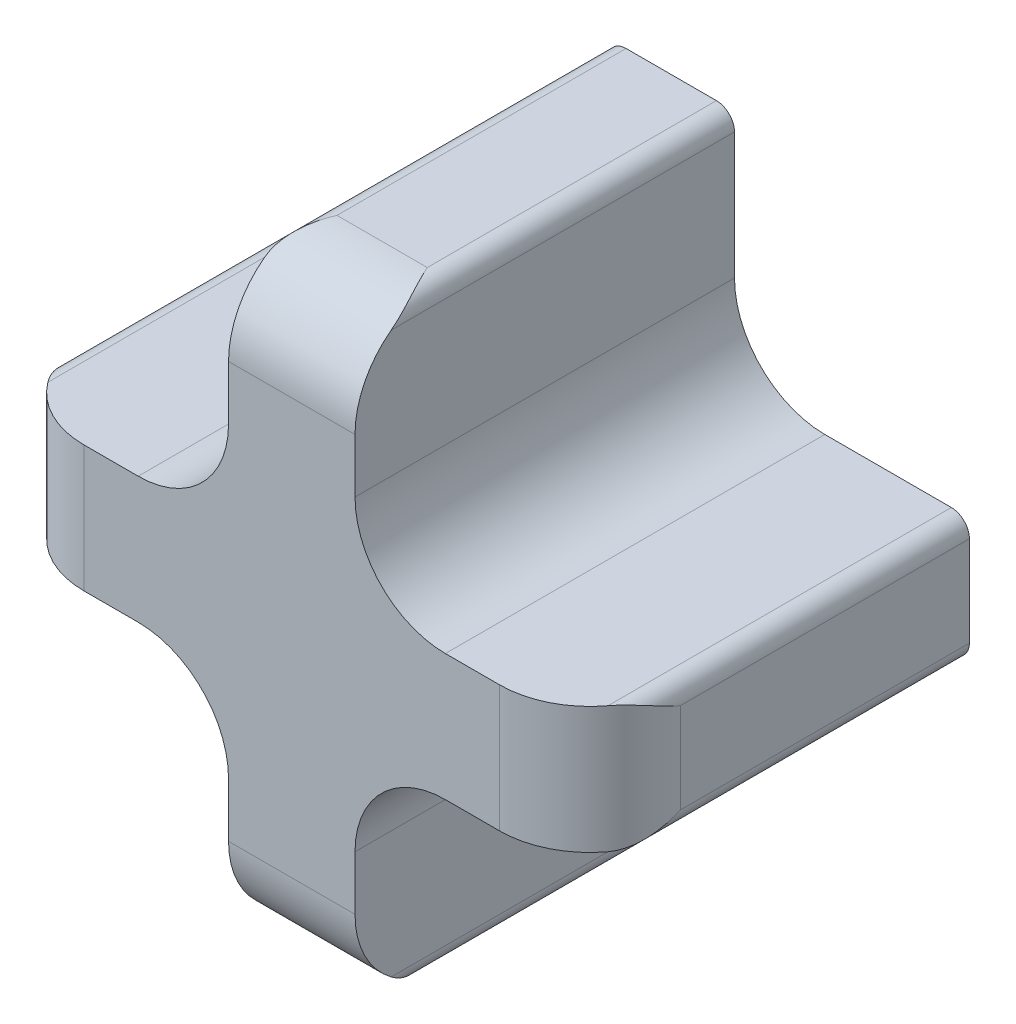
ISO-10303-21;
HEADER;
FILE_DESCRIPTION(('STEP AP214'),'2;1');
FILE_NAME('part.step','',(''),(''),'','','');
FILE_SCHEMA(('AUTOMOTIVE_DESIGN { 1 0 10303 214 1 1 1 1 }'));
ENDSEC;
DATA;
#1=APPLICATION_CONTEXT('core data for automotive mechanical design processes');
#2=APPLICATION_PROTOCOL_DEFINITION('international standard','automotive_design',2000,#1);
#3=PRODUCT_CONTEXT('',#1,'mechanical');
#4=PRODUCT('Part','Part','',(#3));
#5=PRODUCT_RELATED_PRODUCT_CATEGORY('part','',(#4));
#6=PRODUCT_DEFINITION_FORMATION('','',#4);
#7=PRODUCT_DEFINITION_CONTEXT('part definition',#1,'design');
#8=PRODUCT_DEFINITION('design','',#6,#7);
#9=PRODUCT_DEFINITION_SHAPE('','',#8);
#10=(LENGTH_UNIT() NAMED_UNIT(*) SI_UNIT(.MILLI.,.METRE.));
#11=(NAMED_UNIT(*) PLANE_ANGLE_UNIT() SI_UNIT($,.RADIAN.));
#12=(NAMED_UNIT(*) SI_UNIT($,.STERADIAN.) SOLID_ANGLE_UNIT());
#13=UNCERTAINTY_MEASURE_WITH_UNIT(LENGTH_MEASURE(1.E-05),#10,'distance_accuracy_value','');
#14=(GEOMETRIC_REPRESENTATION_CONTEXT(3) GLOBAL_UNCERTAINTY_ASSIGNED_CONTEXT((#13)) GLOBAL_UNIT_ASSIGNED_CONTEXT((#10,
#11,#12)) REPRESENTATION_CONTEXT('',''));
#15=CARTESIAN_POINT('',(0.,0.,0.));
#16=DIRECTION('',(0.,0.,1.));
#17=DIRECTION('',(1.,0.,0.));
#18=AXIS2_PLACEMENT_3D('',#15,#16,#17);
#19=CARTESIAN_POINT('',(-28.6701759385662,-21.7811119836904,2.1));
#20=DIRECTION('',(-1.,0.,0.));
#21=DIRECTION('',(0.,0.,1.));
#22=AXIS2_PLACEMENT_3D('',#19,#20,#21);
#23=PLANE('',#22);
#24=DIRECTION('',(0.,0.,-1.));
#25=VECTOR('',#24,1.);
#26=CARTESIAN_POINT('',(-28.6701759385662,-21.6811119836904,2.1));
#27=LINE('',#26,#25);
#28=CARTESIAN_POINT('',(-28.6701759385662,-21.6811119836904,0.));
#29=VERTEX_POINT('',#28);
#30=CARTESIAN_POINT('',(-28.6701759385662,-21.6811119836904,1.9));
#31=VERTEX_POINT('',#30);
#32=EDGE_CURVE('E280',#29,#31,#27,.F.);
#33=ORIENTED_EDGE('',*,*,#32,.T.);
#34=CARTESIAN_POINT('',(-28.6701759385662,-21.2811119836904,1.6));
#35=DIRECTION('',(-1.,0.,0.));
#36=DIRECTION('',(0.,0.,1.));
#37=AXIS2_PLACEMENT_3D('',#34,#35,#36);
#38=CIRCLE('',#37,0.5);
#39=CARTESIAN_POINT('',(-28.6701759385662,-21.2811119836904,2.1));
#40=VERTEX_POINT('',#39);
#41=EDGE_CURVE('E525',#31,#40,#38,.T.);
#42=ORIENTED_EDGE('',*,*,#41,.T.);
#43=DIRECTION('',(0.,1.,0.));
#44=VECTOR('',#43,1.);
#45=CARTESIAN_POINT('',(-28.6701759385662,-21.7811119836904,2.1));
#46=LINE('',#45,#44);
#47=CARTESIAN_POINT('',(-28.6701759385662,-20.9811119836904,2.1));
#48=VERTEX_POINT('',#47);
#49=EDGE_CURVE('E467',#40,#48,#46,.T.);
#50=ORIENTED_EDGE('',*,*,#49,.T.);
#51=DIRECTION('',(0.,0.,1.));
#52=VECTOR('',#51,1.);
#53=CARTESIAN_POINT('',(-28.6701759385662,-20.9811119836904,0.));
#54=LINE('',#53,#52);
#55=CARTESIAN_POINT('',(-28.6701759385662,-20.9811119836904,0.));
#56=VERTEX_POINT('',#55);
#57=EDGE_CURVE('E298',#48,#56,#54,.F.);
#58=ORIENTED_EDGE('',*,*,#57,.T.);
#59=DIRECTION('',(0.,1.,0.));
#60=VECTOR('',#59,1.);
#61=CARTESIAN_POINT('',(-28.6701759385662,-21.7811119836904,0.));
#62=LINE('',#61,#60);
#63=EDGE_CURVE('E487',#29,#56,#62,.T.);
#64=ORIENTED_EDGE('',*,*,#63,.F.);
#65=EDGE_LOOP('',(#33,#42,#50,#58,#64));
#66=FACE_BOUND('',#65,.T.);
#67=ADVANCED_FACE('F17',(#66),#23,.T.);
#68=CARTESIAN_POINT('',(-27.9701759385662,-21.7811119836904,2.1));
#69=DIRECTION('',(0.,-1.,0.));
#70=DIRECTION('',(1.,0.,0.));
#71=AXIS2_PLACEMENT_3D('',#68,#69,#70);
#72=PLANE('',#71);
#73=DIRECTION('',(0.,0.,-1.));
#74=VECTOR('',#73,1.);
#75=CARTESIAN_POINT('',(-28.0701759385662,-21.7811119836904,2.1));
#76=LINE('',#75,#74);
#77=CARTESIAN_POINT('',(-28.0701759385662,-21.7811119836904,0.));
#78=VERTEX_POINT('',#77);
#79=CARTESIAN_POINT('',(-28.0701759385662,-21.7811119836904,1.6));
#80=VERTEX_POINT('',#79);
#81=EDGE_CURVE('E275',#78,#80,#76,.F.);
#82=ORIENTED_EDGE('',*,*,#81,.T.);
#83=DIRECTION('',(-1.,0.,0.));
#84=VECTOR('',#83,1.);
#85=CARTESIAN_POINT('',(-28.5701759385662,-21.7811119836904,1.6));
#86=LINE('',#85,#84);
#87=CARTESIAN_POINT('',(-28.5701759385662,-21.7811119836904,1.6));
#88=VERTEX_POINT('',#87);
#89=EDGE_CURVE('E592',#80,#88,#86,.T.);
#90=ORIENTED_EDGE('',*,*,#89,.T.);
#91=DIRECTION('',(0.,0.,-1.));
#92=VECTOR('',#91,1.);
#93=CARTESIAN_POINT('',(-28.5701759385662,-21.7811119836904,2.1));
#94=LINE('',#93,#92);
#95=CARTESIAN_POINT('',(-28.5701759385662,-21.7811119836904,0.));
#96=VERTEX_POINT('',#95);
#97=EDGE_CURVE('E278',#88,#96,#94,.T.);
#98=ORIENTED_EDGE('',*,*,#97,.T.);
#99=DIRECTION('',(-1.,0.,0.));
#100=VECTOR('',#99,1.);
#101=CARTESIAN_POINT('',(-27.9701759385662,-21.7811119836904,0.));
#102=LINE('',#101,#100);
#103=EDGE_CURVE('E502',#78,#96,#102,.T.);
#104=ORIENTED_EDGE('',*,*,#103,.F.);
#105=EDGE_LOOP('',(#82,#90,#98,#104));
#106=FACE_BOUND('',#105,.T.);
#107=ADVANCED_FACE('F434',(#106),#72,.T.);
#108=CARTESIAN_POINT('',(-27.9701759385662,-21.7811119836904,2.1));
#109=DIRECTION('',(-1.,0.,0.));
#110=DIRECTION('',(0.,0.,1.));
#111=AXIS2_PLACEMENT_3D('',#108,#109,#110);
#112=PLANE('',#111);
#113=DIRECTION('',(0.,1.,0.));
#114=VECTOR('',#113,1.);
#115=CARTESIAN_POINT('',(-27.9701759385662,-21.7811119836904,2.1));
#116=LINE('',#115,#114);
#117=CARTESIAN_POINT('',(-27.9701759385662,-21.2811119836904,2.1));
#118=VERTEX_POINT('',#117);
#119=CARTESIAN_POINT('',(-27.9701759385662,-20.9811119836904,2.1));
#120=VERTEX_POINT('',#119);
#121=EDGE_CURVE('E231',#118,#120,#116,.T.);
#122=ORIENTED_EDGE('',*,*,#121,.F.);
#123=CARTESIAN_POINT('',(-27.9701759385662,-21.2811119836904,1.6));
#124=DIRECTION('',(-1.,0.,0.));
#125=DIRECTION('',(0.,0.,1.));
#126=AXIS2_PLACEMENT_3D('',#123,#124,#125);
#127=CIRCLE('',#126,0.5);
#128=CARTESIAN_POINT('',(-27.9701759385662,-21.6811119836904,1.9));
#129=VERTEX_POINT('',#128);
#130=EDGE_CURVE('E520',#118,#129,#127,.F.);
#131=ORIENTED_EDGE('',*,*,#130,.T.);
#132=DIRECTION('',(0.,0.,-1.));
#133=VECTOR('',#132,1.);
#134=CARTESIAN_POINT('',(-27.9701759385662,-21.6811119836904,0.));
#135=LINE('',#134,#133);
#136=CARTESIAN_POINT('',(-27.9701759385662,-21.6811119836904,0.));
#137=VERTEX_POINT('',#136);
#138=EDGE_CURVE('E283',#129,#137,#135,.T.);
#139=ORIENTED_EDGE('',*,*,#138,.T.);
#140=DIRECTION('',(0.,1.,0.));
#141=VECTOR('',#140,1.);
#142=CARTESIAN_POINT('',(-27.9701759385662,-21.7811119836904,0.));
#143=LINE('',#142,#141);
#144=CARTESIAN_POINT('',(-27.9701759385662,-20.9811119836904,0.));
#145=VERTEX_POINT('',#144);
#146=EDGE_CURVE('E489',#137,#145,#143,.T.);
#147=ORIENTED_EDGE('',*,*,#146,.T.);
#148=DIRECTION('',(0.,0.,1.));
#149=VECTOR('',#148,1.);
#150=CARTESIAN_POINT('',(-27.9701759385662,-20.9811119836904,2.1));
#151=LINE('',#150,#149);
#152=EDGE_CURVE('E300',#145,#120,#151,.T.);
#153=ORIENTED_EDGE('',*,*,#152,.T.);
#154=EDGE_LOOP('',(#122,#131,#139,#147,#153));
#155=FACE_BOUND('',#154,.T.);
#156=ADVANCED_FACE('F437',(#155),#112,.F.);
#157=CARTESIAN_POINT('',(0.,0.,0.));
#158=DIRECTION('',(0.,0.,-1.));
#159=DIRECTION('',(-1.,0.,0.));
#160=AXIS2_PLACEMENT_3D('',#157,#158,#159);
#161=PLANE('',#160);
#162=DIRECTION('',(0.,1.,0.));
#163=VECTOR('',#162,1.);
#164=CARTESIAN_POINT('',(-29.9701759385662,-20.4811119836904,0.));
#165=LINE('',#164,#163);
#166=CARTESIAN_POINT('',(-29.9701759385662,-20.3811119836904,0.));
#167=VERTEX_POINT('',#166);
#168=CARTESIAN_POINT('',(-29.9701759385662,-19.8811119836904,0.));
#169=VERTEX_POINT('',#168);
#170=EDGE_CURVE('E208',#167,#169,#165,.T.);
#171=ORIENTED_EDGE('',*,*,#170,.T.);
#172=CARTESIAN_POINT('',(-29.8701759385662,-19.8811119836904,0.));
#173=DIRECTION('',(0.,0.,-1.));
#174=DIRECTION('',(-1.,0.,0.));
#175=AXIS2_PLACEMENT_3D('',#172,#173,#174);
#176=CIRCLE('',#175,0.1);
#177=CARTESIAN_POINT('',(-29.8701759385662,-19.7811119836903,0.));
#178=VERTEX_POINT('',#177);
#179=EDGE_CURVE('E250',#169,#178,#176,.T.);
#180=ORIENTED_EDGE('',*,*,#179,.T.);
#181=DIRECTION('',(-1.,0.,0.));
#182=VECTOR('',#181,1.);
#183=CARTESIAN_POINT('',(-26.6701759385662,-19.7811119836903,0.));
#184=LINE('',#183,#182);
#185=CARTESIAN_POINT('',(-29.1701759385662,-19.7811119836903,0.));
#186=VERTEX_POINT('',#185);
#187=EDGE_CURVE('E506',#186,#178,#184,.T.);
#188=ORIENTED_EDGE('',*,*,#187,.F.);
#189=CARTESIAN_POINT('',(-29.1701759385662,-19.2811119836904,0.));
#190=DIRECTION('',(0.,0.,-1.));
#191=DIRECTION('',(-1.,0.,0.));
#192=AXIS2_PLACEMENT_3D('',#189,#190,#191);
#193=CIRCLE('',#192,0.5);
#194=CARTESIAN_POINT('',(-28.6701759385662,-19.2811119836904,0.));
#195=VERTEX_POINT('',#194);
#196=EDGE_CURVE('E311',#186,#195,#193,.F.);
#197=ORIENTED_EDGE('',*,*,#196,.T.);
#198=CARTESIAN_POINT('',(-28.6701759385662,-18.5811119836903,0.));
#199=VERTEX_POINT('',#198);
#200=EDGE_CURVE('E483',#195,#199,#62,.T.);
#201=ORIENTED_EDGE('',*,*,#200,.T.);
#202=CARTESIAN_POINT('',(-28.5701759385662,-18.5811119836903,0.));
#203=DIRECTION('',(0.,0.,-1.));
#204=DIRECTION('',(-1.,0.,0.));
#205=AXIS2_PLACEMENT_3D('',#202,#203,#204);
#206=CIRCLE('',#205,0.1);
#207=CARTESIAN_POINT('',(-28.5701759385662,-18.4811119836904,0.));
#208=VERTEX_POINT('',#207);
#209=EDGE_CURVE('E248',#199,#208,#206,.T.);
#210=ORIENTED_EDGE('',*,*,#209,.T.);
#211=DIRECTION('',(-1.,0.,0.));
#212=VECTOR('',#211,1.);
#213=CARTESIAN_POINT('',(-27.9701759385662,-18.4811119836904,0.));
#214=LINE('',#213,#212);
#215=CARTESIAN_POINT('',(-28.0701759385662,-18.4811119836904,0.));
#216=VERTEX_POINT('',#215);
#217=EDGE_CURVE('E482',#216,#208,#214,.T.);
#218=ORIENTED_EDGE('',*,*,#217,.F.);
#219=CARTESIAN_POINT('',(-28.0701759385662,-18.5811119836903,0.));
#220=DIRECTION('',(0.,0.,-1.));
#221=DIRECTION('',(-1.,0.,0.));
#222=AXIS2_PLACEMENT_3D('',#219,#220,#221);
#223=CIRCLE('',#222,0.1);
#224=CARTESIAN_POINT('',(-27.9701759385662,-18.5811119836903,0.));
#225=VERTEX_POINT('',#224);
#226=EDGE_CURVE('E245',#216,#225,#223,.T.);
#227=ORIENTED_EDGE('',*,*,#226,.T.);
#228=CARTESIAN_POINT('',(-27.9701759385662,-19.2811119836904,0.));
#229=VERTEX_POINT('',#228);
#230=EDGE_CURVE('E486',#229,#225,#143,.T.);
#231=ORIENTED_EDGE('',*,*,#230,.F.);
#232=CARTESIAN_POINT('',(-27.4701759385662,-19.2811119836904,0.));
#233=DIRECTION('',(0.,0.,-1.));
#234=DIRECTION('',(-1.,0.,0.));
#235=AXIS2_PLACEMENT_3D('',#232,#233,#234);
#236=CIRCLE('',#235,0.5);
#237=CARTESIAN_POINT('',(-27.4701759385662,-19.7811119836903,0.));
#238=VERTEX_POINT('',#237);
#239=EDGE_CURVE('E307',#229,#238,#236,.F.);
#240=ORIENTED_EDGE('',*,*,#239,.T.);
#241=CARTESIAN_POINT('',(-26.7701759385662,-19.7811119836903,0.));
#242=VERTEX_POINT('',#241);
#243=EDGE_CURVE('E226',#242,#238,#184,.T.);
#244=ORIENTED_EDGE('',*,*,#243,.F.);
#245=CARTESIAN_POINT('',(-26.7701759385662,-19.8811119836904,0.));
#246=DIRECTION('',(0.,0.,-1.));
#247=DIRECTION('',(-1.,0.,0.));
#248=AXIS2_PLACEMENT_3D('',#245,#246,#247);
#249=CIRCLE('',#248,0.1);
#250=CARTESIAN_POINT('',(-26.6701759385662,-19.8811119836904,0.));
#251=VERTEX_POINT('',#250);
#252=EDGE_CURVE('E243',#242,#251,#249,.T.);
#253=ORIENTED_EDGE('',*,*,#252,.T.);
#254=DIRECTION('',(0.,1.,0.));
#255=VECTOR('',#254,1.);
#256=CARTESIAN_POINT('',(-26.6701759385662,-20.4811119836904,0.));
#257=LINE('',#256,#255);
#258=CARTESIAN_POINT('',(-26.6701759385662,-20.3811119836904,0.));
#259=VERTEX_POINT('',#258);
#260=EDGE_CURVE('E503',#259,#251,#257,.T.);
#261=ORIENTED_EDGE('',*,*,#260,.F.);
#262=CARTESIAN_POINT('',(-26.7701759385662,-20.3811119836904,0.));
#263=DIRECTION('',(0.,0.,-1.));
#264=DIRECTION('',(-1.,0.,0.));
#265=AXIS2_PLACEMENT_3D('',#262,#263,#264);
#266=CIRCLE('',#265,0.1);
#267=CARTESIAN_POINT('',(-26.7701759385662,-20.4811119836904,0.));
#268=VERTEX_POINT('',#267);
#269=EDGE_CURVE('E214',#259,#268,#266,.T.);
#270=ORIENTED_EDGE('',*,*,#269,.T.);
#271=DIRECTION('',(-1.,0.,0.));
#272=VECTOR('',#271,1.);
#273=CARTESIAN_POINT('',(-26.6701759385662,-20.4811119836904,0.));
#274=LINE('',#273,#272);
#275=CARTESIAN_POINT('',(-27.4701759385662,-20.4811119836904,0.));
#276=VERTEX_POINT('',#275);
#277=EDGE_CURVE('E238',#268,#276,#274,.T.);
#278=ORIENTED_EDGE('',*,*,#277,.T.);
#279=CARTESIAN_POINT('',(-27.4701759385662,-20.9811119836904,0.));
#280=DIRECTION('',(0.,0.,-1.));
#281=DIRECTION('',(-1.,0.,0.));
#282=AXIS2_PLACEMENT_3D('',#279,#280,#281);
#283=CIRCLE('',#282,0.5);
#284=EDGE_CURVE('E321',#276,#145,#283,.F.);
#285=ORIENTED_EDGE('',*,*,#284,.T.);
#286=ORIENTED_EDGE('',*,*,#146,.F.);
#287=CARTESIAN_POINT('',(-28.0701759385662,-21.6811119836904,0.));
#288=DIRECTION('',(0.,0.,-1.));
#289=DIRECTION('',(-1.,0.,0.));
#290=AXIS2_PLACEMENT_3D('',#287,#288,#289);
#291=CIRCLE('',#290,0.1);
#292=EDGE_CURVE('E233',#137,#78,#291,.T.);
#293=ORIENTED_EDGE('',*,*,#292,.T.);
#294=ORIENTED_EDGE('',*,*,#103,.T.);
#295=CARTESIAN_POINT('',(-28.5701759385662,-21.6811119836904,0.));
#296=DIRECTION('',(0.,0.,-1.));
#297=DIRECTION('',(-1.,0.,0.));
#298=AXIS2_PLACEMENT_3D('',#295,#296,#297);
#299=CIRCLE('',#298,0.1);
#300=EDGE_CURVE('E215',#96,#29,#299,.T.);
#301=ORIENTED_EDGE('',*,*,#300,.T.);
#302=ORIENTED_EDGE('',*,*,#63,.T.);
#303=CARTESIAN_POINT('',(-29.1701759385662,-20.9811119836904,0.));
#304=DIRECTION('',(0.,0.,-1.));
#305=DIRECTION('',(-1.,0.,0.));
#306=AXIS2_PLACEMENT_3D('',#303,#304,#305);
#307=CIRCLE('',#306,0.5);
#308=CARTESIAN_POINT('',(-29.1701759385662,-20.4811119836904,0.));
#309=VERTEX_POINT('',#308);
#310=EDGE_CURVE('E316',#56,#309,#307,.F.);
#311=ORIENTED_EDGE('',*,*,#310,.T.);
#312=CARTESIAN_POINT('',(-29.8701759385662,-20.4811119836904,0.));
#313=VERTEX_POINT('',#312);
#314=EDGE_CURVE('E210',#309,#313,#274,.T.);
#315=ORIENTED_EDGE('',*,*,#314,.T.);
#316=CARTESIAN_POINT('',(-29.8701759385662,-20.3811119836904,0.));
#317=DIRECTION('',(0.,0.,-1.));
#318=DIRECTION('',(-1.,0.,0.));
#319=AXIS2_PLACEMENT_3D('',#316,#317,#318);
#320=CIRCLE('',#319,0.1);
#321=EDGE_CURVE('E204',#313,#167,#320,.T.);
#322=ORIENTED_EDGE('',*,*,#321,.T.);
#323=EDGE_LOOP('',(#171,#180,#188,#197,#201,#210,#218,#227,#231,#240,#244,#253,#261,#270,#278,
#285,#286,#293,#294,#301,#302,#311,#315,#322));
#324=FACE_BOUND('',#323,.T.);
#325=ADVANCED_FACE('F206',(#324),#161,.T.);
#326=CARTESIAN_POINT('',(0.,0.,2.1));
#327=DIRECTION('',(0.,0.,-1.));
#328=DIRECTION('',(-1.,0.,0.));
#329=AXIS2_PLACEMENT_3D('',#326,#327,#328);
#330=PLANE('',#329);
#331=CARTESIAN_POINT('',(-27.9701759385662,-19.2811119836904,2.1));
#332=VERTEX_POINT('',#331);
#333=CARTESIAN_POINT('',(-27.9701759385662,-18.9811119836904,2.1));
#334=VERTEX_POINT('',#333);
#335=EDGE_CURVE('E235',#332,#334,#116,.T.);
#336=ORIENTED_EDGE('',*,*,#335,.T.);
#337=DIRECTION('',(-1.,0.,0.));
#338=VECTOR('',#337,1.);
#339=CARTESIAN_POINT('',(0.,-18.9811119836904,2.1));
#340=LINE('',#339,#338);
#341=CARTESIAN_POINT('',(-28.6701759385662,-18.9811119836904,2.1));
#342=VERTEX_POINT('',#341);
#343=EDGE_CURVE('E330',#334,#342,#340,.T.);
#344=ORIENTED_EDGE('',*,*,#343,.T.);
#345=CARTESIAN_POINT('',(-28.6701759385662,-19.2811119836904,2.1));
#346=VERTEX_POINT('',#345);
#347=EDGE_CURVE('E476',#346,#342,#46,.T.);
#348=ORIENTED_EDGE('',*,*,#347,.F.);
#349=CARTESIAN_POINT('',(-29.1701759385662,-19.2811119836904,2.1));
#350=DIRECTION('',(0.,0.,-1.));
#351=DIRECTION('',(-1.,0.,0.));
#352=AXIS2_PLACEMENT_3D('',#349,#350,#351);
#353=CIRCLE('',#352,0.5);
#354=CARTESIAN_POINT('',(-29.1701759385662,-19.7811119836903,2.1));
#355=VERTEX_POINT('',#354);
#356=EDGE_CURVE('E309',#346,#355,#353,.T.);
#357=ORIENTED_EDGE('',*,*,#356,.T.);
#358=DIRECTION('',(-1.,0.,0.));
#359=VECTOR('',#358,1.);
#360=CARTESIAN_POINT('',(-26.6701759385662,-19.7811119836903,2.1));
#361=LINE('',#360,#359);
#362=CARTESIAN_POINT('',(-29.4701759385662,-19.7811119836903,2.1));
#363=VERTEX_POINT('',#362);
#364=EDGE_CURVE('E499',#355,#363,#361,.T.);
#365=ORIENTED_EDGE('',*,*,#364,.T.);
#366=DIRECTION('',(0.,1.,0.));
#367=VECTOR('',#366,1.);
#368=CARTESIAN_POINT('',(-29.4701759385662,-20.3811119836904,2.1));
#369=LINE('',#368,#367);
#370=CARTESIAN_POINT('',(-29.4701759385662,-20.4811119836904,2.1));
#371=VERTEX_POINT('',#370);
#372=EDGE_CURVE('E326',#363,#371,#369,.F.);
#373=ORIENTED_EDGE('',*,*,#372,.T.);
#374=DIRECTION('',(-1.,0.,0.));
#375=VECTOR('',#374,1.);
#376=CARTESIAN_POINT('',(-26.6701759385662,-20.4811119836904,2.1));
#377=LINE('',#376,#375);
#378=CARTESIAN_POINT('',(-29.1701759385662,-20.4811119836904,2.1));
#379=VERTEX_POINT('',#378);
#380=EDGE_CURVE('E498',#379,#371,#377,.T.);
#381=ORIENTED_EDGE('',*,*,#380,.F.);
#382=CARTESIAN_POINT('',(-29.1701759385662,-20.9811119836904,2.1));
#383=DIRECTION('',(0.,0.,-1.));
#384=DIRECTION('',(-1.,0.,0.));
#385=AXIS2_PLACEMENT_3D('',#382,#383,#384);
#386=CIRCLE('',#385,0.5);
#387=EDGE_CURVE('E313',#379,#48,#386,.T.);
#388=ORIENTED_EDGE('',*,*,#387,.T.);
#389=ORIENTED_EDGE('',*,*,#49,.F.);
#390=DIRECTION('',(-1.,0.,0.));
#391=VECTOR('',#390,1.);
#392=CARTESIAN_POINT('',(-28.0701759385662,-21.2811119836904,2.1));
#393=LINE('',#392,#391);
#394=EDGE_CURVE('E328',#40,#118,#393,.F.);
#395=ORIENTED_EDGE('',*,*,#394,.T.);
#396=ORIENTED_EDGE('',*,*,#121,.T.);
#397=CARTESIAN_POINT('',(-27.4701759385662,-20.9811119836904,2.1));
#398=DIRECTION('',(0.,0.,-1.));
#399=DIRECTION('',(-1.,0.,0.));
#400=AXIS2_PLACEMENT_3D('',#397,#398,#399);
#401=CIRCLE('',#400,0.5);
#402=CARTESIAN_POINT('',(-27.4701759385662,-20.4811119836904,2.1));
#403=VERTEX_POINT('',#402);
#404=EDGE_CURVE('E318',#120,#403,#401,.T.);
#405=ORIENTED_EDGE('',*,*,#404,.T.);
#406=CARTESIAN_POINT('',(-27.1701759385662,-20.4811119836904,2.1));
#407=VERTEX_POINT('',#406);
#408=EDGE_CURVE('E500',#407,#403,#377,.T.);
#409=ORIENTED_EDGE('',*,*,#408,.F.);
#410=DIRECTION('',(0.,1.,0.));
#411=VECTOR('',#410,1.);
#412=CARTESIAN_POINT('',(-27.1701759385662,0.,2.1));
#413=LINE('',#412,#411);
#414=CARTESIAN_POINT('',(-27.1701759385662,-19.7811119836903,2.1));
#415=VERTEX_POINT('',#414);
#416=EDGE_CURVE('E323',#407,#415,#413,.T.);
#417=ORIENTED_EDGE('',*,*,#416,.T.);
#418=CARTESIAN_POINT('',(-27.4701759385662,-19.7811119836903,2.1));
#419=VERTEX_POINT('',#418);
#420=EDGE_CURVE('E496',#415,#419,#361,.T.);
#421=ORIENTED_EDGE('',*,*,#420,.T.);
#422=CARTESIAN_POINT('',(-27.4701759385662,-19.2811119836904,2.1));
#423=DIRECTION('',(0.,0.,-1.));
#424=DIRECTION('',(-1.,0.,0.));
#425=AXIS2_PLACEMENT_3D('',#422,#423,#424);
#426=CIRCLE('',#425,0.5);
#427=EDGE_CURVE('E305',#419,#332,#426,.T.);
#428=ORIENTED_EDGE('',*,*,#427,.T.);
#429=EDGE_LOOP('',(#336,#344,#348,#357,#365,#373,#381,#388,#389,#395,#396,#405,#409,#417,#421,#428));
#430=FACE_BOUND('',#429,.T.);
#431=ADVANCED_FACE('F446',(#430),#330,.F.);
#432=CARTESIAN_POINT('',(-27.9701759385662,-18.4811119836904,2.1));
#433=DIRECTION('',(0.,-1.,0.));
#434=DIRECTION('',(0.,0.,-1.));
#435=AXIS2_PLACEMENT_3D('',#432,#433,#434);
#436=PLANE('',#435);
#437=DIRECTION('',(0.,0.,-1.));
#438=VECTOR('',#437,1.);
#439=CARTESIAN_POINT('',(-28.5701759385662,-18.4811119836904,2.1));
#440=LINE('',#439,#438);
#441=CARTESIAN_POINT('',(-28.5701759385662,-18.4811119836904,1.6));
#442=VERTEX_POINT('',#441);
#443=EDGE_CURVE('E259',#208,#442,#440,.F.);
#444=ORIENTED_EDGE('',*,*,#443,.T.);
#445=DIRECTION('',(-1.,0.,0.));
#446=VECTOR('',#445,1.);
#447=CARTESIAN_POINT('',(-27.9701759385662,-18.4811119836904,1.6));
#448=LINE('',#447,#446);
#449=CARTESIAN_POINT('',(-28.0701759385662,-18.4811119836904,1.6));
#450=VERTEX_POINT('',#449);
#451=EDGE_CURVE('E342',#442,#450,#448,.F.);
#452=ORIENTED_EDGE('',*,*,#451,.T.);
#453=DIRECTION('',(0.,0.,-1.));
#454=VECTOR('',#453,1.);
#455=CARTESIAN_POINT('',(-28.0701759385662,-18.4811119836904,2.1));
#456=LINE('',#455,#454);
#457=EDGE_CURVE('E257',#450,#216,#456,.T.);
#458=ORIENTED_EDGE('',*,*,#457,.T.);
#459=ORIENTED_EDGE('',*,*,#217,.T.);
#460=EDGE_LOOP('',(#444,#452,#458,#459));
#461=FACE_BOUND('',#460,.T.);
#462=ADVANCED_FACE('F443',(#461),#436,.F.);
#463=ORIENTED_EDGE('',*,*,#347,.T.);
#464=CARTESIAN_POINT('',(-28.6701759385662,-18.9811119836904,1.6));
#465=DIRECTION('',(-1.,0.,0.));
#466=DIRECTION('',(0.,0.,1.));
#467=AXIS2_PLACEMENT_3D('',#464,#465,#466);
#468=CIRCLE('',#467,0.5);
#469=CARTESIAN_POINT('',(-28.6701759385662,-18.5811119836903,1.9));
#470=VERTEX_POINT('',#469);
#471=EDGE_CURVE('E333',#342,#470,#468,.T.);
#472=ORIENTED_EDGE('',*,*,#471,.T.);
#473=DIRECTION('',(0.,0.,-1.));
#474=VECTOR('',#473,1.);
#475=CARTESIAN_POINT('',(-28.6701759385662,-18.5811119836903,0.));
#476=LINE('',#475,#474);
#477=EDGE_CURVE('E255',#470,#199,#476,.T.);
#478=ORIENTED_EDGE('',*,*,#477,.T.);
#479=ORIENTED_EDGE('',*,*,#200,.F.);
#480=DIRECTION('',(0.,0.,1.));
#481=VECTOR('',#480,1.);
#482=CARTESIAN_POINT('',(-28.6701759385662,-19.2811119836904,2.1));
#483=LINE('',#482,#481);
#484=EDGE_CURVE('E290',#195,#346,#483,.T.);
#485=ORIENTED_EDGE('',*,*,#484,.T.);
#486=EDGE_LOOP('',(#463,#472,#478,#479,#485));
#487=FACE_BOUND('',#486,.T.);
#488=ADVANCED_FACE('F442',(#487),#23,.T.);
#489=DIRECTION('',(0.,0.,-1.));
#490=VECTOR('',#489,1.);
#491=CARTESIAN_POINT('',(-27.9701759385662,-18.5811119836903,2.1));
#492=LINE('',#491,#490);
#493=CARTESIAN_POINT('',(-27.9701759385662,-18.5811119836903,1.9));
#494=VERTEX_POINT('',#493);
#495=EDGE_CURVE('E262',#225,#494,#492,.F.);
#496=ORIENTED_EDGE('',*,*,#495,.T.);
#497=CARTESIAN_POINT('',(-27.9701759385662,-18.9811119836904,1.6));
#498=DIRECTION('',(-1.,0.,0.));
#499=DIRECTION('',(0.,0.,1.));
#500=AXIS2_PLACEMENT_3D('',#497,#498,#499);
#501=CIRCLE('',#500,0.5);
#502=EDGE_CURVE('E364',#494,#334,#501,.F.);
#503=ORIENTED_EDGE('',*,*,#502,.T.);
#504=ORIENTED_EDGE('',*,*,#335,.F.);
#505=DIRECTION('',(0.,0.,1.));
#506=VECTOR('',#505,1.);
#507=CARTESIAN_POINT('',(-27.9701759385662,-19.2811119836904,0.));
#508=LINE('',#507,#506);
#509=EDGE_CURVE('E288',#332,#229,#508,.F.);
#510=ORIENTED_EDGE('',*,*,#509,.T.);
#511=ORIENTED_EDGE('',*,*,#230,.T.);
#512=EDGE_LOOP('',(#496,#503,#504,#510,#511));
#513=FACE_BOUND('',#512,.T.);
#514=ADVANCED_FACE('F427',(#513),#112,.F.);
#515=CARTESIAN_POINT('',(-26.6701759385662,-19.7811119836903,2.1));
#516=DIRECTION('',(0.,-1.,0.));
#517=DIRECTION('',(0.,0.,-1.));
#518=AXIS2_PLACEMENT_3D('',#515,#516,#517);
#519=PLANE('',#518);
#520=DIRECTION('',(0.,0.,-1.));
#521=VECTOR('',#520,1.);
#522=CARTESIAN_POINT('',(-29.8701759385662,-19.7811119836903,2.1));
#523=LINE('',#522,#521);
#524=CARTESIAN_POINT('',(-29.8701759385662,-19.7811119836903,1.9));
#525=VERTEX_POINT('',#524);
#526=EDGE_CURVE('E252',#178,#525,#523,.F.);
#527=ORIENTED_EDGE('',*,*,#526,.T.);
#528=CARTESIAN_POINT('',(-29.4701759385662,-19.7811119836903,1.6));
#529=DIRECTION('',(0.,-1.,0.));
#530=DIRECTION('',(0.,0.,-1.));
#531=AXIS2_PLACEMENT_3D('',#528,#529,#530);
#532=CIRCLE('',#531,0.5);
#533=EDGE_CURVE('E410',#525,#363,#532,.F.);
#534=ORIENTED_EDGE('',*,*,#533,.T.);
#535=ORIENTED_EDGE('',*,*,#364,.F.);
#536=DIRECTION('',(0.,0.,1.));
#537=VECTOR('',#536,1.);
#538=CARTESIAN_POINT('',(-29.1701759385662,-19.7811119836903,2.1));
#539=LINE('',#538,#537);
#540=EDGE_CURVE('E293',#355,#186,#539,.F.);
#541=ORIENTED_EDGE('',*,*,#540,.T.);
#542=ORIENTED_EDGE('',*,*,#187,.T.);
#543=EDGE_LOOP('',(#527,#534,#535,#541,#542));
#544=FACE_BOUND('',#543,.T.);
#545=ADVANCED_FACE('F424',(#544),#519,.F.);
#546=CARTESIAN_POINT('',(-29.9701759385662,-20.4811119836904,2.1));
#547=DIRECTION('',(-1.,0.,0.));
#548=DIRECTION('',(0.,-1.,0.));
#549=AXIS2_PLACEMENT_3D('',#546,#547,#548);
#550=PLANE('',#549);
#551=DIRECTION('',(0.,0.,-1.));
#552=VECTOR('',#551,1.);
#553=CARTESIAN_POINT('',(-29.9701759385662,-20.3811119836904,2.1));
#554=LINE('',#553,#552);
#555=CARTESIAN_POINT('',(-29.9701759385662,-20.3811119836904,1.6));
#556=VERTEX_POINT('',#555);
#557=EDGE_CURVE('E221',#167,#556,#554,.F.);
#558=ORIENTED_EDGE('',*,*,#557,.T.);
#559=DIRECTION('',(0.,1.,0.));
#560=VECTOR('',#559,1.);
#561=CARTESIAN_POINT('',(-29.9701759385662,-19.8811119836904,1.6));
#562=LINE('',#561,#560);
#563=CARTESIAN_POINT('',(-29.9701759385662,-19.8811119836904,1.6));
#564=VERTEX_POINT('',#563);
#565=EDGE_CURVE('E411',#556,#564,#562,.T.);
#566=ORIENTED_EDGE('',*,*,#565,.T.);
#567=DIRECTION('',(0.,0.,-1.));
#568=VECTOR('',#567,1.);
#569=CARTESIAN_POINT('',(-29.9701759385662,-19.8811119836904,0.));
#570=LINE('',#569,#568);
#571=EDGE_CURVE('E224',#564,#169,#570,.T.);
#572=ORIENTED_EDGE('',*,*,#571,.T.);
#573=ORIENTED_EDGE('',*,*,#170,.F.);
#574=EDGE_LOOP('',(#558,#566,#572,#573));
#575=FACE_BOUND('',#574,.T.);
#576=ADVANCED_FACE('F219',(#575),#550,.T.);
#577=CARTESIAN_POINT('',(-26.6701759385662,-20.4811119836904,2.1));
#578=DIRECTION('',(0.,-1.,0.));
#579=DIRECTION('',(0.,0.,-1.));
#580=AXIS2_PLACEMENT_3D('',#577,#578,#579);
#581=PLANE('',#580);
#582=ORIENTED_EDGE('',*,*,#380,.T.);
#583=CARTESIAN_POINT('',(-29.4701759385662,-20.4811119836904,1.6));
#584=DIRECTION('',(0.,-1.,0.));
#585=DIRECTION('',(0.,0.,-1.));
#586=AXIS2_PLACEMENT_3D('',#583,#584,#585);
#587=CIRCLE('',#586,0.5);
#588=CARTESIAN_POINT('',(-29.8701759385662,-20.4811119836904,1.9));
#589=VERTEX_POINT('',#588);
#590=EDGE_CURVE('E395',#371,#589,#587,.T.);
#591=ORIENTED_EDGE('',*,*,#590,.T.);
#592=DIRECTION('',(0.,0.,-1.));
#593=VECTOR('',#592,1.);
#594=CARTESIAN_POINT('',(-29.8701759385662,-20.4811119836904,2.1));
#595=LINE('',#594,#593);
#596=EDGE_CURVE('E273',#589,#313,#595,.T.);
#597=ORIENTED_EDGE('',*,*,#596,.T.);
#598=ORIENTED_EDGE('',*,*,#314,.F.);
#599=DIRECTION('',(0.,0.,1.));
#600=VECTOR('',#599,1.);
#601=CARTESIAN_POINT('',(-29.1701759385662,-20.4811119836904,2.1));
#602=LINE('',#601,#600);
#603=EDGE_CURVE('E295',#309,#379,#602,.T.);
#604=ORIENTED_EDGE('',*,*,#603,.T.);
#605=EDGE_LOOP('',(#582,#591,#597,#598,#604));
#606=FACE_BOUND('',#605,.T.);
#607=ADVANCED_FACE('F423',(#606),#581,.T.);
#608=CARTESIAN_POINT('',(-26.6701759385662,-20.4811119836904,2.1));
#609=DIRECTION('',(-1.,0.,0.));
#610=DIRECTION('',(0.,0.,1.));
#611=AXIS2_PLACEMENT_3D('',#608,#609,#610);
#612=PLANE('',#611);
#613=DIRECTION('',(0.,0.,-1.));
#614=VECTOR('',#613,1.);
#615=CARTESIAN_POINT('',(-26.6701759385662,-19.8811119836904,2.1));
#616=LINE('',#615,#614);
#617=CARTESIAN_POINT('',(-26.6701759385662,-19.8811119836904,1.6));
#618=VERTEX_POINT('',#617);
#619=EDGE_CURVE('E269',#251,#618,#616,.F.);
#620=ORIENTED_EDGE('',*,*,#619,.T.);
#621=DIRECTION('',(0.,1.,0.));
#622=VECTOR('',#621,1.);
#623=CARTESIAN_POINT('',(-26.6701759385662,-20.4811119836904,1.6));
#624=LINE('',#623,#622);
#625=CARTESIAN_POINT('',(-26.6701759385662,-20.3811119836904,1.6));
#626=VERTEX_POINT('',#625);
#627=EDGE_CURVE('E40',#618,#626,#624,.F.);
#628=ORIENTED_EDGE('',*,*,#627,.T.);
#629=DIRECTION('',(0.,0.,-1.));
#630=VECTOR('',#629,1.);
#631=CARTESIAN_POINT('',(-26.6701759385662,-20.3811119836904,0.));
#632=LINE('',#631,#630);
#633=EDGE_CURVE('E267',#626,#259,#632,.T.);
#634=ORIENTED_EDGE('',*,*,#633,.T.);
#635=ORIENTED_EDGE('',*,*,#260,.T.);
#636=EDGE_LOOP('',(#620,#628,#634,#635));
#637=FACE_BOUND('',#636,.T.);
#638=ADVANCED_FACE('F419',(#637),#612,.F.);
#639=ORIENTED_EDGE('',*,*,#420,.F.);
#640=CARTESIAN_POINT('',(-27.1701759385662,-19.7811119836903,1.6));
#641=DIRECTION('',(0.,-1.,0.));
#642=DIRECTION('',(0.,0.,-1.));
#643=AXIS2_PLACEMENT_3D('',#640,#641,#642);
#644=CIRCLE('',#643,0.5);
#645=CARTESIAN_POINT('',(-26.7701759385662,-19.7811119836903,1.9));
#646=VERTEX_POINT('',#645);
#647=EDGE_CURVE('E386',#415,#646,#644,.F.);
#648=ORIENTED_EDGE('',*,*,#647,.T.);
#649=DIRECTION('',(0.,0.,-1.));
#650=VECTOR('',#649,1.);
#651=CARTESIAN_POINT('',(-26.7701759385662,-19.7811119836903,2.1));
#652=LINE('',#651,#650);
#653=EDGE_CURVE('E265',#646,#242,#652,.T.);
#654=ORIENTED_EDGE('',*,*,#653,.T.);
#655=ORIENTED_EDGE('',*,*,#243,.T.);
#656=DIRECTION('',(0.,0.,1.));
#657=VECTOR('',#656,1.);
#658=CARTESIAN_POINT('',(-27.4701759385662,-19.7811119836903,2.1));
#659=LINE('',#658,#657);
#660=EDGE_CURVE('E285',#238,#419,#659,.T.);
#661=ORIENTED_EDGE('',*,*,#660,.T.);
#662=EDGE_LOOP('',(#639,#648,#654,#655,#661));
#663=FACE_BOUND('',#662,.T.);
#664=ADVANCED_FACE('F422',(#663),#519,.F.);
#665=DIRECTION('',(0.,0.,-1.));
#666=VECTOR('',#665,1.);
#667=CARTESIAN_POINT('',(-26.7701759385662,-20.4811119836904,2.1));
#668=LINE('',#667,#666);
#669=CARTESIAN_POINT('',(-26.7701759385662,-20.4811119836904,1.9));
#670=VERTEX_POINT('',#669);
#671=EDGE_CURVE('E271',#268,#670,#668,.F.);
#672=ORIENTED_EDGE('',*,*,#671,.T.);
#673=CARTESIAN_POINT('',(-27.1701759385662,-20.4811119836904,1.6));
#674=DIRECTION('',(0.,-1.,0.));
#675=DIRECTION('',(0.,0.,-1.));
#676=AXIS2_PLACEMENT_3D('',#673,#674,#675);
#677=CIRCLE('',#676,0.5);
#678=EDGE_CURVE('E11',#670,#407,#677,.T.);
#679=ORIENTED_EDGE('',*,*,#678,.T.);
#680=ORIENTED_EDGE('',*,*,#408,.T.);
#681=DIRECTION('',(0.,0.,1.));
#682=VECTOR('',#681,1.);
#683=CARTESIAN_POINT('',(-27.4701759385662,-20.4811119836904,2.1));
#684=LINE('',#683,#682);
#685=EDGE_CURVE('E303',#403,#276,#684,.F.);
#686=ORIENTED_EDGE('',*,*,#685,.T.);
#687=ORIENTED_EDGE('',*,*,#277,.F.);
#688=EDGE_LOOP('',(#672,#679,#680,#686,#687));
#689=FACE_BOUND('',#688,.T.);
#690=ADVANCED_FACE('F417',(#689),#581,.T.);
#691=CARTESIAN_POINT('',(-29.8701759385662,-19.8811119836904,2.1));
#692=DIRECTION('',(0.,0.,1.));
#693=DIRECTION('',(1.,0.,0.));
#694=AXIS2_PLACEMENT_3D('',#691,#692,#693);
#695=CYLINDRICAL_SURFACE('',#694,0.1);
#696=ORIENTED_EDGE('',*,*,#571,.F.);
#697=CARTESIAN_POINT('',(-29.8701759385662,-19.7811119836903,1.9));
#698=CARTESIAN_POINT('',(-29.8796560210982,-19.7811611379054,1.8873707780294));
#699=CARTESIAN_POINT('',(-29.8884673577222,-19.7824486836681,1.87436565898576));
#700=CARTESIAN_POINT('',(-29.9046642347288,-19.7868652579121,1.84790514790276));
#701=CARTESIAN_POINT('',(-29.9120593217321,-19.7899813360618,1.83445354395838));
#702=CARTESIAN_POINT('',(-29.929739056253,-19.7998121325875,1.79854636733832));
#703=CARTESIAN_POINT('',(-29.9388644208424,-19.8075548202635,1.77581255908412));
#704=CARTESIAN_POINT('',(-29.9536265568572,-19.8248473623768,1.72985254057713));
#705=CARTESIAN_POINT('',(-29.9592486703175,-19.8344045945233,1.70662467641817));
#706=CARTESIAN_POINT('',(-29.967635976988,-19.8556574037008,1.65696642011536));
#707=CARTESIAN_POINT('',(-29.969943689469,-19.8674701259397,1.63050646687591));
#708=CARTESIAN_POINT('',(-29.9701703747612,-19.8798948719029,1.60272156698595));
#709=CARTESIAN_POINT('',(-29.9701759283797,-19.8805034603922,1.60136072385964));
#710=CARTESIAN_POINT('',(-29.9701759385662,-19.8811119836904,1.6));
#711=B_SPLINE_CURVE_WITH_KNOTS('',3,(#697,#698,#699,#700,#701,#702,#703,#704,#705,#706,#707,
#708,#709,#710),.UNSPECIFIED.,.F.,.F.,(4,2,2,2,2,2,4),(0.,0.0471658603953293,0.0940016393432151,
0.170666329943138,0.247649676756883,0.334481197287879,0.338953364301339),.UNSPECIFIED.);
#712=EDGE_CURVE('E405',#564,#525,#711,.F.);
#713=ORIENTED_EDGE('',*,*,#712,.T.);
#714=ORIENTED_EDGE('',*,*,#526,.F.);
#715=ORIENTED_EDGE('',*,*,#179,.F.);
#716=EDGE_LOOP('',(#696,#713,#714,#715));
#717=FACE_BOUND('',#716,.T.);
#718=ADVANCED_FACE('F413',(#717),#695,.T.);
#719=CARTESIAN_POINT('',(-28.5701759385662,-18.5811119836903,2.1));
#720=DIRECTION('',(0.,0.,1.));
#721=DIRECTION('',(1.,0.,0.));
#722=AXIS2_PLACEMENT_3D('',#719,#720,#721);
#723=CYLINDRICAL_SURFACE('',#722,0.1);
#724=ORIENTED_EDGE('',*,*,#477,.F.);
#725=CARTESIAN_POINT('',(-28.6701759385662,-18.5811119836903,1.9));
#726=CARTESIAN_POINT('',(-28.6701267843511,-18.5716319011584,1.88737077802942));
#727=CARTESIAN_POINT('',(-28.6688392385884,-18.5628205645344,1.87436565898579));
#728=CARTESIAN_POINT('',(-28.6644226643445,-18.5466236875278,1.84790514790278));
#729=CARTESIAN_POINT('',(-28.6613065861947,-18.5392286005245,1.83445354395839));
#730=CARTESIAN_POINT('',(-28.6514757896691,-18.5215488660036,1.7985463673383));
#731=CARTESIAN_POINT('',(-28.643733101993,-18.5124235014142,1.77581255908411));
#732=CARTESIAN_POINT('',(-28.6264405598797,-18.4976613653993,1.72985254057714));
#733=CARTESIAN_POINT('',(-28.6168833277332,-18.4920392519389,1.7066246764182));
#734=CARTESIAN_POINT('',(-28.5956305185559,-18.4836519452686,1.65696642011532));
#735=CARTESIAN_POINT('',(-28.5838177963172,-18.4813442327879,1.63050646687579));
#736=CARTESIAN_POINT('',(-28.5713930503537,-18.4811175474954,1.60272156698595));
#737=CARTESIAN_POINT('',(-28.5707844618644,-18.4811119938768,1.60136072385963));
#738=CARTESIAN_POINT('',(-28.5701759385662,-18.4811119836904,1.6));
#739=B_SPLINE_CURVE_WITH_KNOTS('',3,(#725,#726,#727,#728,#729,#730,#731,#732,#733,#734,#735,
#736,#737,#738),.UNSPECIFIED.,.F.,.F.,(4,2,2,2,2,2,4),(0.,0.0471658603952968,0.0940016393431904,
0.170666329943143,0.247649676756859,0.334481197287859,0.338953364301331),.UNSPECIFIED.);
#740=EDGE_CURVE('E335',#470,#442,#739,.T.);
#741=ORIENTED_EDGE('',*,*,#740,.T.);
#742=ORIENTED_EDGE('',*,*,#443,.F.);
#743=ORIENTED_EDGE('',*,*,#209,.F.);
#744=EDGE_LOOP('',(#724,#741,#742,#743));
#745=FACE_BOUND('',#744,.T.);
#746=ADVANCED_FACE('F344',(#745),#723,.T.);
#747=CARTESIAN_POINT('',(-28.0701759385662,-18.5811119836903,2.1));
#748=DIRECTION('',(0.,0.,-1.));
#749=DIRECTION('',(-1.,0.,0.));
#750=AXIS2_PLACEMENT_3D('',#747,#748,#749);
#751=CYLINDRICAL_SURFACE('',#750,0.1);
#752=ORIENTED_EDGE('',*,*,#457,.F.);
#753=CARTESIAN_POINT('',(-27.9701759385662,-18.5811119836903,1.9));
#754=CARTESIAN_POINT('',(-27.9702250927813,-18.5716319011584,1.88737077802942));
#755=CARTESIAN_POINT('',(-27.971512638544,-18.5628205645344,1.87436565898579));
#756=CARTESIAN_POINT('',(-27.9759292127879,-18.5466236875278,1.84790514790278));
#757=CARTESIAN_POINT('',(-27.9790452909377,-18.5392286005245,1.83445354395839));
#758=CARTESIAN_POINT('',(-27.9888760874633,-18.5215488660036,1.7985463673383));
#759=CARTESIAN_POINT('',(-27.9966187751394,-18.5124235014142,1.7758125590841));
#760=CARTESIAN_POINT('',(-28.0139113172527,-18.4976613653993,1.72985254057713));
#761=CARTESIAN_POINT('',(-28.0234685493991,-18.4920392519389,1.70662467641817));
#762=CARTESIAN_POINT('',(-28.0447213585767,-18.4836519452686,1.65696642011535));
#763=CARTESIAN_POINT('',(-28.0565340808155,-18.4813442327879,1.6305064668759));
#764=CARTESIAN_POINT('',(-28.0689588267788,-18.4811175474954,1.60272156698595));
#765=CARTESIAN_POINT('',(-28.069567415268,-18.4811119938768,1.60136072385963));
#766=CARTESIAN_POINT('',(-28.0701759385662,-18.4811119836904,1.6));
#767=B_SPLINE_CURVE_WITH_KNOTS('',3,(#753,#754,#755,#756,#757,#758,#759,#760,#761,#762,#763,
#764,#765,#766),.UNSPECIFIED.,.F.,.F.,(4,2,2,2,2,2,4),(0.,0.0471658603952911,0.0940016393431903,
0.170666329943156,0.247649676756877,0.334481197287879,0.338953364301329),.UNSPECIFIED.);
#768=EDGE_CURVE('E359',#450,#494,#767,.F.);
#769=ORIENTED_EDGE('',*,*,#768,.T.);
#770=ORIENTED_EDGE('',*,*,#495,.F.);
#771=ORIENTED_EDGE('',*,*,#226,.F.);
#772=EDGE_LOOP('',(#752,#769,#770,#771));
#773=FACE_BOUND('',#772,.T.);
#774=ADVANCED_FACE('F366',(#773),#751,.T.);
#775=CARTESIAN_POINT('',(-26.7701759385662,-19.8811119836904,2.1));
#776=DIRECTION('',(0.,0.,-1.));
#777=DIRECTION('',(-1.,0.,0.));
#778=AXIS2_PLACEMENT_3D('',#775,#776,#777);
#779=CYLINDRICAL_SURFACE('',#778,0.1);
#780=ORIENTED_EDGE('',*,*,#653,.F.);
#781=CARTESIAN_POINT('',(-26.7701759385662,-19.7811119836903,1.9));
#782=CARTESIAN_POINT('',(-26.7606958560342,-19.7811611379055,1.8873707780294));
#783=CARTESIAN_POINT('',(-26.7518845194102,-19.7824486836681,1.87436565898576));
#784=CARTESIAN_POINT('',(-26.7356876424036,-19.7868652579121,1.84790514790276));
#785=CARTESIAN_POINT('',(-26.7282925554003,-19.7899813360618,1.83445354395838));
#786=CARTESIAN_POINT('',(-26.7106128208794,-19.7998121325875,1.79854636733832));
#787=CARTESIAN_POINT('',(-26.70148745629,-19.8075548202635,1.77581255908412));
#788=CARTESIAN_POINT('',(-26.6867253202752,-19.8248473623768,1.72985254057714));
#789=CARTESIAN_POINT('',(-26.6811032068148,-19.8344045945233,1.70662467641818));
#790=CARTESIAN_POINT('',(-26.6727159001444,-19.8556574037008,1.65696642011535));
#791=CARTESIAN_POINT('',(-26.6704081876634,-19.8674701259396,1.6305064668759));
#792=CARTESIAN_POINT('',(-26.6701815023712,-19.8798948719029,1.60272156698595));
#793=CARTESIAN_POINT('',(-26.6701759487527,-19.8805034603922,1.60136072385963));
#794=CARTESIAN_POINT('',(-26.6701759385662,-19.8811119836904,1.6));
#795=B_SPLINE_CURVE_WITH_KNOTS('',3,(#781,#782,#783,#784,#785,#786,#787,#788,#789,#790,#791,
#792,#793,#794),.UNSPECIFIED.,.F.,.F.,(4,2,2,2,2,2,4),(0.,0.0471658603953306,0.0940016393432134,
0.170666329943139,0.247649676756882,0.334481197287887,0.338953364301338),.UNSPECIFIED.);
#796=EDGE_CURVE('E380',#646,#618,#795,.T.);
#797=ORIENTED_EDGE('',*,*,#796,.T.);
#798=ORIENTED_EDGE('',*,*,#619,.F.);
#799=ORIENTED_EDGE('',*,*,#252,.F.);
#800=EDGE_LOOP('',(#780,#797,#798,#799));
#801=FACE_BOUND('',#800,.T.);
#802=ADVANCED_FACE('F370',(#801),#779,.T.);
#803=CARTESIAN_POINT('',(-26.7701759385662,-20.3811119836904,2.1));
#804=DIRECTION('',(0.,0.,1.));
#805=DIRECTION('',(1.,0.,0.));
#806=AXIS2_PLACEMENT_3D('',#803,#804,#805);
#807=CYLINDRICAL_SURFACE('',#806,0.1);
#808=ORIENTED_EDGE('',*,*,#633,.F.);
#809=CARTESIAN_POINT('',(-26.7701759385662,-20.4811119836904,1.9));
#810=CARTESIAN_POINT('',(-26.7606958560342,-20.4810628294752,1.8873707780294));
#811=CARTESIAN_POINT('',(-26.7518845194102,-20.4797752837126,1.87436565898576));
#812=CARTESIAN_POINT('',(-26.7356876424036,-20.4753587094687,1.84790514790276));
#813=CARTESIAN_POINT('',(-26.7282925554003,-20.4722426313189,1.83445354395838));
#814=CARTESIAN_POINT('',(-26.7106128208794,-20.4624118347933,1.79854636733832));
#815=CARTESIAN_POINT('',(-26.70148745629,-20.4546691471172,1.77581255908413));
#816=CARTESIAN_POINT('',(-26.6867253202752,-20.4373766050038,1.72985254057716));
#817=CARTESIAN_POINT('',(-26.6811032068148,-20.4278193728574,1.70662467641821));
#818=CARTESIAN_POINT('',(-26.6727159001444,-20.40656656368,1.65696642011532));
#819=CARTESIAN_POINT('',(-26.6704081876634,-20.3947538414414,1.63050646687579));
#820=CARTESIAN_POINT('',(-26.6701815023712,-20.3823290954778,1.60272156698595));
#821=CARTESIAN_POINT('',(-26.6701759487527,-20.3817205069886,1.60136072385963));
#822=CARTESIAN_POINT('',(-26.6701759385662,-20.3811119836904,1.6));
#823=B_SPLINE_CURVE_WITH_KNOTS('',3,(#809,#810,#811,#812,#813,#814,#815,#816,#817,#818,#819,
#820,#821,#822),.UNSPECIFIED.,.F.,.F.,(4,2,2,2,2,2,4),(0.,0.0471658603953325,0.0940016393432043,
0.170666329943121,0.247649676756867,0.334481197287873,0.338953364301345),.UNSPECIFIED.);
#824=EDGE_CURVE('E26',#626,#670,#823,.F.);
#825=ORIENTED_EDGE('',*,*,#824,.T.);
#826=ORIENTED_EDGE('',*,*,#671,.F.);
#827=ORIENTED_EDGE('',*,*,#269,.F.);
#828=EDGE_LOOP('',(#808,#825,#826,#827));
#829=FACE_BOUND('',#828,.T.);
#830=ADVANCED_FACE('F375',(#829),#807,.T.);
#831=CARTESIAN_POINT('',(-29.8701759385662,-20.3811119836904,2.1));
#832=DIRECTION('',(0.,0.,-1.));
#833=DIRECTION('',(-1.,0.,0.));
#834=AXIS2_PLACEMENT_3D('',#831,#832,#833);
#835=CYLINDRICAL_SURFACE('',#834,0.1);
#836=ORIENTED_EDGE('',*,*,#596,.F.);
#837=CARTESIAN_POINT('',(-29.8701759385662,-20.4811119836904,1.9));
#838=CARTESIAN_POINT('',(-29.8796560210982,-20.4810628294752,1.8873707780294));
#839=CARTESIAN_POINT('',(-29.8884673577222,-20.4797752837126,1.87436565898576));
#840=CARTESIAN_POINT('',(-29.9046642347288,-20.4753587094687,1.84790514790275));
#841=CARTESIAN_POINT('',(-29.9120593217321,-20.4722426313189,1.83445354395838));
#842=CARTESIAN_POINT('',(-29.929739056253,-20.4624118347933,1.79854636733832));
#843=CARTESIAN_POINT('',(-29.9388644208424,-20.4546691471172,1.77581255908413));
#844=CARTESIAN_POINT('',(-29.9536265568572,-20.4373766050038,1.72985254057716));
#845=CARTESIAN_POINT('',(-29.9592486703175,-20.4278193728574,1.70662467641821));
#846=CARTESIAN_POINT('',(-29.967635976988,-20.40656656368,1.65696642011531));
#847=CARTESIAN_POINT('',(-29.969943689469,-20.3947538414414,1.63050646687578));
#848=CARTESIAN_POINT('',(-29.9701703747612,-20.3823290954778,1.60272156698594));
#849=CARTESIAN_POINT('',(-29.9701759283797,-20.3817205069886,1.60136072385963));
#850=CARTESIAN_POINT('',(-29.9701759385662,-20.3811119836904,1.6));
#851=B_SPLINE_CURVE_WITH_KNOTS('',3,(#837,#838,#839,#840,#841,#842,#843,#844,#845,#846,#847,
#848,#849,#850),.UNSPECIFIED.,.F.,.F.,(4,2,2,2,2,2,4),(0.,0.0471658603953369,0.0940016393432062,
0.17066632994312,0.247649676756869,0.334481197287879,0.338953364301346),.UNSPECIFIED.);
#852=EDGE_CURVE('E230',#589,#556,#851,.T.);
#853=ORIENTED_EDGE('',*,*,#852,.T.);
#854=ORIENTED_EDGE('',*,*,#557,.F.);
#855=ORIENTED_EDGE('',*,*,#321,.F.);
#856=EDGE_LOOP('',(#836,#853,#854,#855));
#857=FACE_BOUND('',#856,.T.);
#858=ADVANCED_FACE('F228',(#857),#835,.T.);
#859=CARTESIAN_POINT('',(-28.5701759385662,-21.6811119836904,2.1));
#860=DIRECTION('',(0.,0.,-1.));
#861=DIRECTION('',(-1.,0.,0.));
#862=AXIS2_PLACEMENT_3D('',#859,#860,#861);
#863=CYLINDRICAL_SURFACE('',#862,0.1);
#864=ORIENTED_EDGE('',*,*,#97,.F.);
#865=CARTESIAN_POINT('',(-28.6701759385662,-21.6811119836904,1.9));
#866=CARTESIAN_POINT('',(-28.6701267843511,-21.6905920662224,1.88737077802943));
#867=CARTESIAN_POINT('',(-28.6688392385884,-21.6994034028464,1.87436565898579));
#868=CARTESIAN_POINT('',(-28.6644226643445,-21.7156002798529,1.84790514790278));
#869=CARTESIAN_POINT('',(-28.6613065861947,-21.7229953668563,1.83445354395838));
#870=CARTESIAN_POINT('',(-28.6514757896691,-21.7406751013772,1.79854636733831));
#871=CARTESIAN_POINT('',(-28.643733101993,-21.7498004659665,1.77581255908414));
#872=CARTESIAN_POINT('',(-28.6264405598797,-21.7645626019814,1.72985254057716));
#873=CARTESIAN_POINT('',(-28.6168833277333,-21.7701847154418,1.70662467641818));
#874=CARTESIAN_POINT('',(-28.5956305185558,-21.7785720221122,1.65696642011534));
#875=CARTESIAN_POINT('',(-28.5838177963169,-21.7808797345932,1.63050646687592));
#876=CARTESIAN_POINT('',(-28.5713930503536,-21.7811064198854,1.60272156698595));
#877=CARTESIAN_POINT('',(-28.5707844618644,-21.7811119735039,1.60136072385964));
#878=CARTESIAN_POINT('',(-28.5701759385662,-21.7811119836904,1.6));
#879=B_SPLINE_CURVE_WITH_KNOTS('',3,(#865,#866,#867,#868,#869,#870,#871,#872,#873,#874,#875,
#876,#877,#878),.UNSPECIFIED.,.F.,.F.,(4,2,2,2,2,2,4),(0.,0.0471658603953242,0.0940016393432156,
0.170666329943144,0.247649676756881,0.334481197287892,0.338953364301353),.UNSPECIFIED.);
#880=EDGE_CURVE('E594',#88,#31,#879,.F.);
#881=ORIENTED_EDGE('',*,*,#880,.T.);
#882=ORIENTED_EDGE('',*,*,#32,.F.);
#883=ORIENTED_EDGE('',*,*,#300,.F.);
#884=EDGE_LOOP('',(#864,#881,#882,#883));
#885=FACE_BOUND('',#884,.T.);
#886=ADVANCED_FACE('F537',(#885),#863,.T.);
#887=CARTESIAN_POINT('',(-28.0701759385662,-21.6811119836904,2.1));
#888=DIRECTION('',(0.,0.,1.));
#889=DIRECTION('',(1.,0.,0.));
#890=AXIS2_PLACEMENT_3D('',#887,#888,#889);
#891=CYLINDRICAL_SURFACE('',#890,0.1);
#892=ORIENTED_EDGE('',*,*,#138,.F.);
#893=CARTESIAN_POINT('',(-27.9701759385662,-21.6811119836904,1.9));
#894=CARTESIAN_POINT('',(-27.9702250927813,-21.6905920662224,1.88737077802942));
#895=CARTESIAN_POINT('',(-27.971512638544,-21.6994034028464,1.87436565898578));
#896=CARTESIAN_POINT('',(-27.9759292127879,-21.7156002798529,1.84790514790277));
#897=CARTESIAN_POINT('',(-27.9790452909377,-21.7229953668563,1.83445354395838));
#898=CARTESIAN_POINT('',(-27.9888760874633,-21.7406751013772,1.7985463673383));
#899=CARTESIAN_POINT('',(-27.9966187751393,-21.7498004659665,1.7758125590841));
#900=CARTESIAN_POINT('',(-28.0139113172527,-21.7645626019814,1.72985254057714));
#901=CARTESIAN_POINT('',(-28.0234685493992,-21.7701847154418,1.7066246764182));
#902=CARTESIAN_POINT('',(-28.0447213585766,-21.7785720221121,1.65696642011532));
#903=CARTESIAN_POINT('',(-28.0565340808152,-21.7808797345929,1.63050646687577));
#904=CARTESIAN_POINT('',(-28.0689588267787,-21.7811064198854,1.60272156698594));
#905=CARTESIAN_POINT('',(-28.069567415268,-21.7811119735039,1.60136072385963));
#906=CARTESIAN_POINT('',(-28.0701759385662,-21.7811119836904,1.6));
#907=B_SPLINE_CURVE_WITH_KNOTS('',3,(#893,#894,#895,#896,#897,#898,#899,#900,#901,#902,#903,
#904,#905,#906),.UNSPECIFIED.,.F.,.F.,(4,2,2,2,2,2,4),(0.,0.0471658603953039,0.0940016393431901,
0.170666329943149,0.247649676756877,0.334481197287863,0.33895336430133),.UNSPECIFIED.);
#908=EDGE_CURVE('E519',#129,#80,#907,.T.);
#909=ORIENTED_EDGE('',*,*,#908,.T.);
#910=ORIENTED_EDGE('',*,*,#81,.F.);
#911=ORIENTED_EDGE('',*,*,#292,.F.);
#912=EDGE_LOOP('',(#892,#909,#910,#911));
#913=FACE_BOUND('',#912,.T.);
#914=ADVANCED_FACE('F532',(#913),#891,.T.);
#915=CARTESIAN_POINT('',(-27.4701759385662,-19.2811119836904,2.1));
#916=DIRECTION('',(0.,0.,-1.));
#917=DIRECTION('',(-1.,0.,0.));
#918=AXIS2_PLACEMENT_3D('',#915,#916,#917);
#919=CYLINDRICAL_SURFACE('',#918,0.5);
#920=ORIENTED_EDGE('',*,*,#239,.F.);
#921=ORIENTED_EDGE('',*,*,#509,.F.);
#922=ORIENTED_EDGE('',*,*,#427,.F.);
#923=ORIENTED_EDGE('',*,*,#660,.F.);
#924=EDGE_LOOP('',(#920,#921,#922,#923));
#925=FACE_BOUND('',#924,.T.);
#926=ADVANCED_FACE('F536',(#925),#919,.F.);
#927=CARTESIAN_POINT('',(-29.1701759385662,-19.2811119836904,2.1));
#928=DIRECTION('',(0.,0.,1.));
#929=DIRECTION('',(1.,0.,0.));
#930=AXIS2_PLACEMENT_3D('',#927,#928,#929);
#931=CYLINDRICAL_SURFACE('',#930,0.5);
#932=ORIENTED_EDGE('',*,*,#196,.F.);
#933=ORIENTED_EDGE('',*,*,#540,.F.);
#934=ORIENTED_EDGE('',*,*,#356,.F.);
#935=ORIENTED_EDGE('',*,*,#484,.F.);
#936=EDGE_LOOP('',(#932,#933,#934,#935));
#937=FACE_BOUND('',#936,.T.);
#938=ADVANCED_FACE('F541',(#937),#931,.F.);
#939=CARTESIAN_POINT('',(-29.1701759385662,-20.9811119836904,2.1));
#940=DIRECTION('',(0.,0.,-1.));
#941=DIRECTION('',(-1.,0.,0.));
#942=AXIS2_PLACEMENT_3D('',#939,#940,#941);
#943=CYLINDRICAL_SURFACE('',#942,0.5);
#944=ORIENTED_EDGE('',*,*,#310,.F.);
#945=ORIENTED_EDGE('',*,*,#57,.F.);
#946=ORIENTED_EDGE('',*,*,#387,.F.);
#947=ORIENTED_EDGE('',*,*,#603,.F.);
#948=EDGE_LOOP('',(#944,#945,#946,#947));
#949=FACE_BOUND('',#948,.T.);
#950=ADVANCED_FACE('F544',(#949),#943,.F.);
#951=CARTESIAN_POINT('',(-27.4701759385662,-20.9811119836904,2.1));
#952=DIRECTION('',(0.,0.,1.));
#953=DIRECTION('',(1.,0.,0.));
#954=AXIS2_PLACEMENT_3D('',#951,#952,#953);
#955=CYLINDRICAL_SURFACE('',#954,0.5);
#956=ORIENTED_EDGE('',*,*,#284,.F.);
#957=ORIENTED_EDGE('',*,*,#685,.F.);
#958=ORIENTED_EDGE('',*,*,#404,.F.);
#959=ORIENTED_EDGE('',*,*,#152,.F.);
#960=EDGE_LOOP('',(#956,#957,#958,#959));
#961=FACE_BOUND('',#960,.T.);
#962=ADVANCED_FACE('F354',(#961),#955,.F.);
#963=CARTESIAN_POINT('',(0.,-18.9811119836904,1.6));
#964=DIRECTION('',(-1.,0.,0.));
#965=DIRECTION('',(0.,0.,1.));
#966=AXIS2_PLACEMENT_3D('',#963,#964,#965);
#967=CYLINDRICAL_SURFACE('',#966,0.5);
#968=ORIENTED_EDGE('',*,*,#768,.F.);
#969=ORIENTED_EDGE('',*,*,#451,.F.);
#970=ORIENTED_EDGE('',*,*,#740,.F.);
#971=ORIENTED_EDGE('',*,*,#471,.F.);
#972=ORIENTED_EDGE('',*,*,#343,.F.);
#973=ORIENTED_EDGE('',*,*,#502,.F.);
#974=EDGE_LOOP('',(#968,#969,#970,#971,#972,#973));
#975=FACE_BOUND('',#974,.T.);
#976=ADVANCED_FACE('F348',(#975),#967,.T.);
#977=CARTESIAN_POINT('',(-27.9701759385662,-21.2811119836904,1.6));
#978=DIRECTION('',(1.,0.,0.));
#979=DIRECTION('',(0.,1.,0.));
#980=AXIS2_PLACEMENT_3D('',#977,#978,#979);
#981=CYLINDRICAL_SURFACE('',#980,0.5);
#982=ORIENTED_EDGE('',*,*,#130,.F.);
#983=ORIENTED_EDGE('',*,*,#394,.F.);
#984=ORIENTED_EDGE('',*,*,#41,.F.);
#985=ORIENTED_EDGE('',*,*,#880,.F.);
#986=ORIENTED_EDGE('',*,*,#89,.F.);
#987=ORIENTED_EDGE('',*,*,#908,.F.);
#988=EDGE_LOOP('',(#982,#983,#984,#985,#986,#987));
#989=FACE_BOUND('',#988,.T.);
#990=ADVANCED_FACE('F353',(#989),#981,.T.);
#991=CARTESIAN_POINT('',(-29.4701759385662,-20.4811119836904,1.6));
#992=DIRECTION('',(0.,-1.,0.));
#993=DIRECTION('',(1.,0.,0.));
#994=AXIS2_PLACEMENT_3D('',#991,#992,#993);
#995=CYLINDRICAL_SURFACE('',#994,0.5);
#996=ORIENTED_EDGE('',*,*,#590,.F.);
#997=ORIENTED_EDGE('',*,*,#372,.F.);
#998=ORIENTED_EDGE('',*,*,#533,.F.);
#999=ORIENTED_EDGE('',*,*,#712,.F.);
#1000=ORIENTED_EDGE('',*,*,#565,.F.);
#1001=ORIENTED_EDGE('',*,*,#852,.F.);
#1002=EDGE_LOOP('',(#996,#997,#998,#999,#1000,#1001));
#1003=FACE_BOUND('',#1002,.T.);
#1004=ADVANCED_FACE('F399',(#1003),#995,.T.);
#1005=CARTESIAN_POINT('',(-27.1701759385662,0.,1.6));
#1006=DIRECTION('',(0.,1.,0.));
#1007=DIRECTION('',(0.,0.,1.));
#1008=AXIS2_PLACEMENT_3D('',#1005,#1006,#1007);
#1009=CYLINDRICAL_SURFACE('',#1008,0.5);
#1010=ORIENTED_EDGE('',*,*,#824,.F.);
#1011=ORIENTED_EDGE('',*,*,#627,.F.);
#1012=ORIENTED_EDGE('',*,*,#796,.F.);
#1013=ORIENTED_EDGE('',*,*,#647,.F.);
#1014=ORIENTED_EDGE('',*,*,#416,.F.);
#1015=ORIENTED_EDGE('',*,*,#678,.F.);
#1016=EDGE_LOOP('',(#1010,#1011,#1012,#1013,#1014,#1015));
#1017=FACE_BOUND('',#1016,.T.);
#1018=ADVANCED_FACE('F19',(#1017),#1009,.T.);
#1019=CLOSED_SHELL('',(#67,#107,#156,#325,#431,#462,#488,#514,#545,#576,#607,#638,#664,#690,
#718,#746,#774,#802,#830,#858,#886,#914,#926,#938,#950,#962,#976,#990,#1004,#1018));
#1020=MANIFOLD_SOLID_BREP('B1',#1019);
#1021=ADVANCED_BREP_SHAPE_REPRESENTATION('',(#18,#1020),#14);
#1022=SHAPE_DEFINITION_REPRESENTATION(#9,#1021);
ENDSEC;
END-ISO-10303-21;
